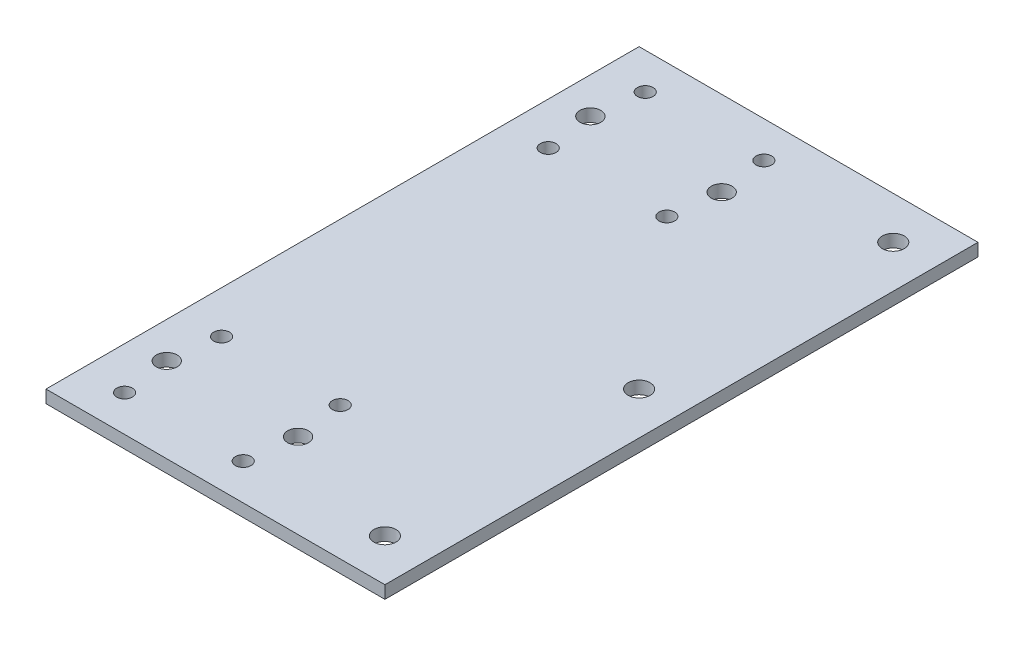
ISO-10303-21;
HEADER;
FILE_DESCRIPTION(('STEP AP214'),'2;1');
FILE_NAME('part.step','',(''),(''),'','','');
FILE_SCHEMA(('AUTOMOTIVE_DESIGN { 1 0 10303 214 1 1 1 1 }'));
ENDSEC;
DATA;
#1=APPLICATION_CONTEXT('core data for automotive mechanical design processes');
#2=APPLICATION_PROTOCOL_DEFINITION('international standard','automotive_design',2000,#1);
#3=PRODUCT_CONTEXT('',#1,'mechanical');
#4=PRODUCT('Part','Part','',(#3));
#5=PRODUCT_RELATED_PRODUCT_CATEGORY('part','',(#4));
#6=PRODUCT_DEFINITION_FORMATION('','',#4);
#7=PRODUCT_DEFINITION_CONTEXT('part definition',#1,'design');
#8=PRODUCT_DEFINITION('design','',#6,#7);
#9=PRODUCT_DEFINITION_SHAPE('','',#8);
#10=(LENGTH_UNIT() NAMED_UNIT(*) SI_UNIT(.MILLI.,.METRE.));
#11=(NAMED_UNIT(*) PLANE_ANGLE_UNIT() SI_UNIT($,.RADIAN.));
#12=(NAMED_UNIT(*) SI_UNIT($,.STERADIAN.) SOLID_ANGLE_UNIT());
#13=UNCERTAINTY_MEASURE_WITH_UNIT(LENGTH_MEASURE(1.E-05),#10,'distance_accuracy_value','');
#14=(GEOMETRIC_REPRESENTATION_CONTEXT(3) GLOBAL_UNCERTAINTY_ASSIGNED_CONTEXT((#13)) GLOBAL_UNIT_ASSIGNED_CONTEXT((#10,
#11,#12)) REPRESENTATION_CONTEXT('',''));
#15=CARTESIAN_POINT('',(0.,0.,0.));
#16=DIRECTION('',(0.,0.,1.));
#17=DIRECTION('',(1.,0.,0.));
#18=AXIS2_PLACEMENT_3D('',#15,#16,#17);
#19=CARTESIAN_POINT('',(40.,3.,0.));
#20=DIRECTION('',(-1.,0.,0.));
#21=DIRECTION('',(0.,0.,1.));
#22=AXIS2_PLACEMENT_3D('',#19,#20,#21);
#23=PLANE('',#22);
#24=DIRECTION('',(0.,0.,-1.));
#25=VECTOR('',#24,1.);
#26=CARTESIAN_POINT('',(40.,0.,0.));
#27=LINE('',#26,#25);
#28=CARTESIAN_POINT('',(40.,0.,70.));
#29=VERTEX_POINT('',#28);
#30=CARTESIAN_POINT('',(40.,0.,-70.));
#31=VERTEX_POINT('',#30);
#32=EDGE_CURVE('E166',#29,#31,#27,.T.);
#33=ORIENTED_EDGE('',*,*,#32,.T.);
#34=DIRECTION('',(0.,-1.,0.));
#35=VECTOR('',#34,1.);
#36=CARTESIAN_POINT('',(40.,3.,-70.));
#37=LINE('',#36,#35);
#38=CARTESIAN_POINT('',(40.,3.,-70.));
#39=VERTEX_POINT('',#38);
#40=EDGE_CURVE('E11',#39,#31,#37,.T.);
#41=ORIENTED_EDGE('',*,*,#40,.F.);
#42=DIRECTION('',(0.,0.,-1.));
#43=VECTOR('',#42,1.);
#44=CARTESIAN_POINT('',(40.,3.,0.));
#45=LINE('',#44,#43);
#46=CARTESIAN_POINT('',(40.,3.,70.));
#47=VERTEX_POINT('',#46);
#48=EDGE_CURVE('E89',#47,#39,#45,.T.);
#49=ORIENTED_EDGE('',*,*,#48,.F.);
#50=DIRECTION('',(0.,-1.,0.));
#51=VECTOR('',#50,1.);
#52=CARTESIAN_POINT('',(40.,3.,70.));
#53=LINE('',#52,#51);
#54=EDGE_CURVE('E161',#47,#29,#53,.T.);
#55=ORIENTED_EDGE('',*,*,#54,.T.);
#56=EDGE_LOOP('',(#33,#41,#49,#55));
#57=FACE_BOUND('',#56,.T.);
#58=ADVANCED_FACE('F46',(#57),#23,.F.);
#59=CARTESIAN_POINT('',(0.,3.,-70.));
#60=DIRECTION('',(0.,0.,-1.));
#61=DIRECTION('',(-1.,0.,0.));
#62=AXIS2_PLACEMENT_3D('',#59,#60,#61);
#63=PLANE('',#62);
#64=DIRECTION('',(1.,0.,0.));
#65=VECTOR('',#64,1.);
#66=CARTESIAN_POINT('',(0.,0.,-70.));
#67=LINE('',#66,#65);
#68=CARTESIAN_POINT('',(-40.,0.,-70.));
#69=VERTEX_POINT('',#68);
#70=EDGE_CURVE('E98',#69,#31,#67,.T.);
#71=ORIENTED_EDGE('',*,*,#70,.F.);
#72=DIRECTION('',(0.,-1.,0.));
#73=VECTOR('',#72,1.);
#74=CARTESIAN_POINT('',(-40.,3.,-70.));
#75=LINE('',#74,#73);
#76=CARTESIAN_POINT('',(-40.,3.,-70.));
#77=VERTEX_POINT('',#76);
#78=EDGE_CURVE('E57',#77,#69,#75,.T.);
#79=ORIENTED_EDGE('',*,*,#78,.F.);
#80=DIRECTION('',(1.,0.,0.));
#81=VECTOR('',#80,1.);
#82=CARTESIAN_POINT('',(0.,3.,-70.));
#83=LINE('',#82,#81);
#84=EDGE_CURVE('E96',#77,#39,#83,.T.);
#85=ORIENTED_EDGE('',*,*,#84,.T.);
#86=ORIENTED_EDGE('',*,*,#40,.T.);
#87=EDGE_LOOP('',(#71,#79,#85,#86));
#88=FACE_BOUND('',#87,.T.);
#89=ADVANCED_FACE('F95',(#88),#63,.T.);
#90=CARTESIAN_POINT('',(-40.,3.,0.));
#91=DIRECTION('',(-1.,0.,0.));
#92=DIRECTION('',(0.,0.,1.));
#93=AXIS2_PLACEMENT_3D('',#90,#91,#92);
#94=PLANE('',#93);
#95=DIRECTION('',(0.,0.,-1.));
#96=VECTOR('',#95,1.);
#97=CARTESIAN_POINT('',(-40.,0.,0.));
#98=LINE('',#97,#96);
#99=CARTESIAN_POINT('',(-40.,0.,70.));
#100=VERTEX_POINT('',#99);
#101=EDGE_CURVE('E172',#100,#69,#98,.T.);
#102=ORIENTED_EDGE('',*,*,#101,.F.);
#103=DIRECTION('',(0.,-1.,0.));
#104=VECTOR('',#103,1.);
#105=CARTESIAN_POINT('',(-40.,3.,70.));
#106=LINE('',#105,#104);
#107=CARTESIAN_POINT('',(-40.,3.,70.));
#108=VERTEX_POINT('',#107);
#109=EDGE_CURVE('E81',#108,#100,#106,.T.);
#110=ORIENTED_EDGE('',*,*,#109,.F.);
#111=DIRECTION('',(0.,0.,-1.));
#112=VECTOR('',#111,1.);
#113=CARTESIAN_POINT('',(-40.,3.,0.));
#114=LINE('',#113,#112);
#115=EDGE_CURVE('E107',#108,#77,#114,.T.);
#116=ORIENTED_EDGE('',*,*,#115,.T.);
#117=ORIENTED_EDGE('',*,*,#78,.T.);
#118=EDGE_LOOP('',(#102,#110,#116,#117));
#119=FACE_BOUND('',#118,.T.);
#120=ADVANCED_FACE('F110',(#119),#94,.T.);
#121=CARTESIAN_POINT('',(-0.499999999999992,3.,-50.));
#122=DIRECTION('',(0.,-1.,0.));
#123=DIRECTION('',(0.,0.,-1.));
#124=AXIS2_PLACEMENT_3D('',#121,#122,#123);
#125=CYLINDRICAL_SURFACE('',#124,2.45);
#126=CARTESIAN_POINT('',(-0.499999999999992,3.,-50.));
#127=DIRECTION('',(0.,1.,0.));
#128=DIRECTION('',(0.,0.,1.));
#129=AXIS2_PLACEMENT_3D('',#126,#127,#128);
#130=CIRCLE('',#129,2.45);
#131=CARTESIAN_POINT('',(-0.499999999999992,3.,-47.55));
#132=VERTEX_POINT('',#131);
#133=EDGE_CURVE('E153',#132,#132,#130,.T.);
#134=ORIENTED_EDGE('',*,*,#133,.T.);
#135=EDGE_LOOP('',(#134));
#136=FACE_BOUND('',#135,.T.);
#137=CARTESIAN_POINT('',(-0.499999999999992,0.,-50.));
#138=DIRECTION('',(0.,1.,0.));
#139=DIRECTION('',(0.,0.,1.));
#140=AXIS2_PLACEMENT_3D('',#137,#138,#139);
#141=CIRCLE('',#140,2.45);
#142=CARTESIAN_POINT('',(-0.499999999999992,0.,-47.55));
#143=VERTEX_POINT('',#142);
#144=EDGE_CURVE('E213',#143,#143,#141,.T.);
#145=ORIENTED_EDGE('',*,*,#144,.F.);
#146=EDGE_LOOP('',(#145));
#147=FACE_BOUND('',#146,.T.);
#148=ADVANCED_FACE('F262',(#136,#147),#125,.F.);
#149=CARTESIAN_POINT('',(-2.00000000000001,3.,-61.45));
#150=DIRECTION('',(0.,-1.,0.));
#151=DIRECTION('',(0.,0.,-1.));
#152=AXIS2_PLACEMENT_3D('',#149,#150,#151);
#153=CYLINDRICAL_SURFACE('',#152,1.85);
#154=CARTESIAN_POINT('',(-2.00000000000001,3.,-61.45));
#155=DIRECTION('',(0.,1.,0.));
#156=DIRECTION('',(0.,0.,1.));
#157=AXIS2_PLACEMENT_3D('',#154,#155,#156);
#158=CIRCLE('',#157,1.85);
#159=CARTESIAN_POINT('',(-2.00000000000001,3.,-59.6));
#160=VERTEX_POINT('',#159);
#161=EDGE_CURVE('E149',#160,#160,#158,.F.);
#162=ORIENTED_EDGE('',*,*,#161,.F.);
#163=EDGE_LOOP('',(#162));
#164=FACE_BOUND('',#163,.T.);
#165=CARTESIAN_POINT('',(-2.00000000000001,0.,-61.45));
#166=DIRECTION('',(0.,1.,0.));
#167=DIRECTION('',(0.,0.,1.));
#168=AXIS2_PLACEMENT_3D('',#165,#166,#167);
#169=CIRCLE('',#168,1.85);
#170=CARTESIAN_POINT('',(-2.00000000000001,0.,-59.6));
#171=VERTEX_POINT('',#170);
#172=EDGE_CURVE('E209',#171,#171,#169,.F.);
#173=ORIENTED_EDGE('',*,*,#172,.T.);
#174=EDGE_LOOP('',(#173));
#175=FACE_BOUND('',#174,.T.);
#176=ADVANCED_FACE('F297',(#164,#175),#153,.F.);
#177=CARTESIAN_POINT('',(-2.00000000000001,3.,-38.55));
#178=DIRECTION('',(0.,-1.,0.));
#179=DIRECTION('',(0.,0.,-1.));
#180=AXIS2_PLACEMENT_3D('',#177,#178,#179);
#181=CYLINDRICAL_SURFACE('',#180,1.85);
#182=CARTESIAN_POINT('',(-2.00000000000001,3.,-38.55));
#183=DIRECTION('',(0.,1.,0.));
#184=DIRECTION('',(0.,0.,1.));
#185=AXIS2_PLACEMENT_3D('',#182,#183,#184);
#186=CIRCLE('',#185,1.85);
#187=CARTESIAN_POINT('',(-2.00000000000001,3.,-36.7));
#188=VERTEX_POINT('',#187);
#189=EDGE_CURVE('E145',#188,#188,#186,.T.);
#190=ORIENTED_EDGE('',*,*,#189,.T.);
#191=EDGE_LOOP('',(#190));
#192=FACE_BOUND('',#191,.T.);
#193=CARTESIAN_POINT('',(-2.00000000000001,0.,-38.55));
#194=DIRECTION('',(0.,1.,0.));
#195=DIRECTION('',(0.,0.,1.));
#196=AXIS2_PLACEMENT_3D('',#193,#194,#195);
#197=CIRCLE('',#196,1.85);
#198=CARTESIAN_POINT('',(-2.00000000000001,0.,-36.7));
#199=VERTEX_POINT('',#198);
#200=EDGE_CURVE('E205',#199,#199,#197,.T.);
#201=ORIENTED_EDGE('',*,*,#200,.F.);
#202=EDGE_LOOP('',(#201));
#203=FACE_BOUND('',#202,.T.);
#204=ADVANCED_FACE('F293',(#192,#203),#181,.F.);
#205=CARTESIAN_POINT('',(-30.,3.,-38.55));
#206=DIRECTION('',(0.,-1.,0.));
#207=DIRECTION('',(0.,0.,-1.));
#208=AXIS2_PLACEMENT_3D('',#205,#206,#207);
#209=CYLINDRICAL_SURFACE('',#208,1.85);
#210=CARTESIAN_POINT('',(-30.,3.,-38.55));
#211=DIRECTION('',(0.,1.,0.));
#212=DIRECTION('',(0.,0.,1.));
#213=AXIS2_PLACEMENT_3D('',#210,#211,#212);
#214=CIRCLE('',#213,1.85);
#215=CARTESIAN_POINT('',(-30.,3.,-36.7));
#216=VERTEX_POINT('',#215);
#217=EDGE_CURVE('E141',#216,#216,#214,.F.);
#218=ORIENTED_EDGE('',*,*,#217,.F.);
#219=EDGE_LOOP('',(#218));
#220=FACE_BOUND('',#219,.T.);
#221=CARTESIAN_POINT('',(-30.,0.,-38.55));
#222=DIRECTION('',(0.,1.,0.));
#223=DIRECTION('',(0.,0.,1.));
#224=AXIS2_PLACEMENT_3D('',#221,#222,#223);
#225=CIRCLE('',#224,1.85);
#226=CARTESIAN_POINT('',(-30.,0.,-36.7));
#227=VERTEX_POINT('',#226);
#228=EDGE_CURVE('E201',#227,#227,#225,.F.);
#229=ORIENTED_EDGE('',*,*,#228,.T.);
#230=EDGE_LOOP('',(#229));
#231=FACE_BOUND('',#230,.T.);
#232=ADVANCED_FACE('F289',(#220,#231),#209,.F.);
#233=CARTESIAN_POINT('',(-30.,3.,61.4500000000001));
#234=DIRECTION('',(0.,-1.,0.));
#235=DIRECTION('',(0.,0.,-1.));
#236=AXIS2_PLACEMENT_3D('',#233,#234,#235);
#237=CYLINDRICAL_SURFACE('',#236,1.85);
#238=CARTESIAN_POINT('',(-30.,3.,61.4500000000001));
#239=DIRECTION('',(0.,1.,0.));
#240=DIRECTION('',(0.,0.,1.));
#241=AXIS2_PLACEMENT_3D('',#238,#239,#240);
#242=CIRCLE('',#241,1.85);
#243=CARTESIAN_POINT('',(-30.,3.,63.3000000000001));
#244=VERTEX_POINT('',#243);
#245=EDGE_CURVE('E137',#244,#244,#242,.F.);
#246=ORIENTED_EDGE('',*,*,#245,.F.);
#247=EDGE_LOOP('',(#246));
#248=FACE_BOUND('',#247,.T.);
#249=CARTESIAN_POINT('',(-30.,0.,61.4500000000001));
#250=DIRECTION('',(0.,1.,0.));
#251=DIRECTION('',(0.,0.,1.));
#252=AXIS2_PLACEMENT_3D('',#249,#250,#251);
#253=CIRCLE('',#252,1.85);
#254=CARTESIAN_POINT('',(-30.,0.,63.3000000000001));
#255=VERTEX_POINT('',#254);
#256=EDGE_CURVE('E197',#255,#255,#253,.F.);
#257=ORIENTED_EDGE('',*,*,#256,.T.);
#258=EDGE_LOOP('',(#257));
#259=FACE_BOUND('',#258,.T.);
#260=ADVANCED_FACE('F285',(#248,#259),#237,.F.);
#261=CARTESIAN_POINT('',(-31.5,3.,50.));
#262=DIRECTION('',(0.,-1.,0.));
#263=DIRECTION('',(0.,0.,-1.));
#264=AXIS2_PLACEMENT_3D('',#261,#262,#263);
#265=CYLINDRICAL_SURFACE('',#264,2.45);
#266=CARTESIAN_POINT('',(-31.5,3.,50.));
#267=DIRECTION('',(0.,1.,0.));
#268=DIRECTION('',(0.,0.,1.));
#269=AXIS2_PLACEMENT_3D('',#266,#267,#268);
#270=CIRCLE('',#269,2.45);
#271=CARTESIAN_POINT('',(-31.5,3.,52.4500000000001));
#272=VERTEX_POINT('',#271);
#273=EDGE_CURVE('E133',#272,#272,#270,.T.);
#274=ORIENTED_EDGE('',*,*,#273,.T.);
#275=EDGE_LOOP('',(#274));
#276=FACE_BOUND('',#275,.T.);
#277=CARTESIAN_POINT('',(-31.5,0.,50.));
#278=DIRECTION('',(0.,1.,0.));
#279=DIRECTION('',(0.,0.,1.));
#280=AXIS2_PLACEMENT_3D('',#277,#278,#279);
#281=CIRCLE('',#280,2.45);
#282=CARTESIAN_POINT('',(-31.5,0.,52.4500000000001));
#283=VERTEX_POINT('',#282);
#284=EDGE_CURVE('E193',#283,#283,#281,.T.);
#285=ORIENTED_EDGE('',*,*,#284,.F.);
#286=EDGE_LOOP('',(#285));
#287=FACE_BOUND('',#286,.T.);
#288=ADVANCED_FACE('F281',(#276,#287),#265,.F.);
#289=CARTESIAN_POINT('',(-30.,3.,38.55));
#290=DIRECTION('',(0.,-1.,0.));
#291=DIRECTION('',(0.,0.,-1.));
#292=AXIS2_PLACEMENT_3D('',#289,#290,#291);
#293=CYLINDRICAL_SURFACE('',#292,1.85);
#294=CARTESIAN_POINT('',(-30.,3.,38.55));
#295=DIRECTION('',(0.,1.,0.));
#296=DIRECTION('',(0.,0.,1.));
#297=AXIS2_PLACEMENT_3D('',#294,#295,#296);
#298=CIRCLE('',#297,1.85);
#299=CARTESIAN_POINT('',(-30.,3.,40.4));
#300=VERTEX_POINT('',#299);
#301=EDGE_CURVE('E129',#300,#300,#298,.T.);
#302=ORIENTED_EDGE('',*,*,#301,.T.);
#303=EDGE_LOOP('',(#302));
#304=FACE_BOUND('',#303,.T.);
#305=CARTESIAN_POINT('',(-30.,0.,38.55));
#306=DIRECTION('',(0.,1.,0.));
#307=DIRECTION('',(0.,0.,1.));
#308=AXIS2_PLACEMENT_3D('',#305,#306,#307);
#309=CIRCLE('',#308,1.85);
#310=CARTESIAN_POINT('',(-30.,0.,40.4));
#311=VERTEX_POINT('',#310);
#312=EDGE_CURVE('E189',#311,#311,#309,.T.);
#313=ORIENTED_EDGE('',*,*,#312,.F.);
#314=EDGE_LOOP('',(#313));
#315=FACE_BOUND('',#314,.T.);
#316=ADVANCED_FACE('F277',(#304,#315),#293,.F.);
#317=CARTESIAN_POINT('',(-2.00000000000001,3.,61.4500000000001));
#318=DIRECTION('',(0.,-1.,0.));
#319=DIRECTION('',(0.,0.,-1.));
#320=AXIS2_PLACEMENT_3D('',#317,#318,#319);
#321=CYLINDRICAL_SURFACE('',#320,1.85);
#322=CARTESIAN_POINT('',(-2.00000000000001,3.,61.4500000000001));
#323=DIRECTION('',(0.,1.,0.));
#324=DIRECTION('',(0.,0.,1.));
#325=AXIS2_PLACEMENT_3D('',#322,#323,#324);
#326=CIRCLE('',#325,1.85);
#327=CARTESIAN_POINT('',(-2.00000000000001,3.,63.3000000000001));
#328=VERTEX_POINT('',#327);
#329=EDGE_CURVE('E125',#328,#328,#326,.T.);
#330=ORIENTED_EDGE('',*,*,#329,.T.);
#331=EDGE_LOOP('',(#330));
#332=FACE_BOUND('',#331,.T.);
#333=CARTESIAN_POINT('',(-2.00000000000001,0.,61.4500000000001));
#334=DIRECTION('',(0.,1.,0.));
#335=DIRECTION('',(0.,0.,1.));
#336=AXIS2_PLACEMENT_3D('',#333,#334,#335);
#337=CIRCLE('',#336,1.85);
#338=CARTESIAN_POINT('',(-2.00000000000001,0.,63.3000000000001));
#339=VERTEX_POINT('',#338);
#340=EDGE_CURVE('E185',#339,#339,#337,.T.);
#341=ORIENTED_EDGE('',*,*,#340,.F.);
#342=EDGE_LOOP('',(#341));
#343=FACE_BOUND('',#342,.T.);
#344=ADVANCED_FACE('F273',(#332,#343),#321,.F.);
#345=CARTESIAN_POINT('',(-2.00000000000001,3.,38.55));
#346=DIRECTION('',(0.,-1.,0.));
#347=DIRECTION('',(0.,0.,-1.));
#348=AXIS2_PLACEMENT_3D('',#345,#346,#347);
#349=CYLINDRICAL_SURFACE('',#348,1.85);
#350=CARTESIAN_POINT('',(-2.00000000000001,3.,38.55));
#351=DIRECTION('',(0.,1.,0.));
#352=DIRECTION('',(0.,0.,1.));
#353=AXIS2_PLACEMENT_3D('',#350,#351,#352);
#354=CIRCLE('',#353,1.85);
#355=CARTESIAN_POINT('',(-2.00000000000001,3.,40.4));
#356=VERTEX_POINT('',#355);
#357=EDGE_CURVE('E121',#356,#356,#354,.F.);
#358=ORIENTED_EDGE('',*,*,#357,.F.);
#359=EDGE_LOOP('',(#358));
#360=FACE_BOUND('',#359,.T.);
#361=CARTESIAN_POINT('',(-2.00000000000001,0.,38.55));
#362=DIRECTION('',(0.,1.,0.));
#363=DIRECTION('',(0.,0.,1.));
#364=AXIS2_PLACEMENT_3D('',#361,#362,#363);
#365=CIRCLE('',#364,1.85);
#366=CARTESIAN_POINT('',(-2.00000000000001,0.,40.4));
#367=VERTEX_POINT('',#366);
#368=EDGE_CURVE('E181',#367,#367,#365,.F.);
#369=ORIENTED_EDGE('',*,*,#368,.T.);
#370=EDGE_LOOP('',(#369));
#371=FACE_BOUND('',#370,.T.);
#372=ADVANCED_FACE('F269',(#360,#371),#349,.F.);
#373=CARTESIAN_POINT('',(-0.499999999999992,3.,50.));
#374=DIRECTION('',(0.,-1.,0.));
#375=DIRECTION('',(0.,0.,-1.));
#376=AXIS2_PLACEMENT_3D('',#373,#374,#375);
#377=CYLINDRICAL_SURFACE('',#376,2.45);
#378=CARTESIAN_POINT('',(-0.499999999999992,3.,50.));
#379=DIRECTION('',(0.,1.,0.));
#380=DIRECTION('',(0.,0.,1.));
#381=AXIS2_PLACEMENT_3D('',#378,#379,#380);
#382=CIRCLE('',#381,2.45);
#383=CARTESIAN_POINT('',(-0.499999999999992,3.,52.4500000000001));
#384=VERTEX_POINT('',#383);
#385=EDGE_CURVE('E114',#384,#384,#382,.F.);
#386=ORIENTED_EDGE('',*,*,#385,.F.);
#387=EDGE_LOOP('',(#386));
#388=FACE_BOUND('',#387,.T.);
#389=CARTESIAN_POINT('',(-0.499999999999992,0.,50.));
#390=DIRECTION('',(0.,1.,0.));
#391=DIRECTION('',(0.,0.,1.));
#392=AXIS2_PLACEMENT_3D('',#389,#390,#391);
#393=CIRCLE('',#392,2.45);
#394=CARTESIAN_POINT('',(-0.499999999999992,0.,52.4500000000001));
#395=VERTEX_POINT('',#394);
#396=EDGE_CURVE('E177',#395,#395,#393,.F.);
#397=ORIENTED_EDGE('',*,*,#396,.T.);
#398=EDGE_LOOP('',(#397));
#399=FACE_BOUND('',#398,.T.);
#400=ADVANCED_FACE('F266',(#388,#399),#377,.F.);
#401=CARTESIAN_POINT('',(0.,3.,70.));
#402=DIRECTION('',(0.,0.,-1.));
#403=DIRECTION('',(-1.,0.,0.));
#404=AXIS2_PLACEMENT_3D('',#401,#402,#403);
#405=PLANE('',#404);
#406=DIRECTION('',(1.,0.,0.));
#407=VECTOR('',#406,1.);
#408=CARTESIAN_POINT('',(0.,0.,70.));
#409=LINE('',#408,#407);
#410=EDGE_CURVE('E84',#100,#29,#409,.T.);
#411=ORIENTED_EDGE('',*,*,#410,.T.);
#412=ORIENTED_EDGE('',*,*,#54,.F.);
#413=DIRECTION('',(1.,0.,0.));
#414=VECTOR('',#413,1.);
#415=CARTESIAN_POINT('',(0.,3.,70.));
#416=LINE('',#415,#414);
#417=EDGE_CURVE('E66',#108,#47,#416,.T.);
#418=ORIENTED_EDGE('',*,*,#417,.F.);
#419=ORIENTED_EDGE('',*,*,#109,.T.);
#420=EDGE_LOOP('',(#411,#412,#418,#419));
#421=FACE_BOUND('',#420,.T.);
#422=ADVANCED_FACE('F263',(#421),#405,.F.);
#423=CARTESIAN_POINT('',(-30.,3.,-61.45));
#424=DIRECTION('',(0.,-1.,0.));
#425=DIRECTION('',(0.,0.,-1.));
#426=AXIS2_PLACEMENT_3D('',#423,#424,#425);
#427=CYLINDRICAL_SURFACE('',#426,1.85);
#428=CARTESIAN_POINT('',(-30.,3.,-61.45));
#429=DIRECTION('',(0.,1.,0.));
#430=DIRECTION('',(0.,0.,1.));
#431=AXIS2_PLACEMENT_3D('',#428,#429,#430);
#432=CIRCLE('',#431,1.85);
#433=CARTESIAN_POINT('',(-30.,3.,-59.6));
#434=VERTEX_POINT('',#433);
#435=EDGE_CURVE('E221',#434,#434,#432,.T.);
#436=ORIENTED_EDGE('',*,*,#435,.T.);
#437=EDGE_LOOP('',(#436));
#438=FACE_BOUND('',#437,.T.);
#439=CARTESIAN_POINT('',(-30.,0.,-61.45));
#440=DIRECTION('',(0.,1.,0.));
#441=DIRECTION('',(0.,0.,1.));
#442=AXIS2_PLACEMENT_3D('',#439,#440,#441);
#443=CIRCLE('',#442,1.85);
#444=CARTESIAN_POINT('',(-30.,0.,-59.6));
#445=VERTEX_POINT('',#444);
#446=EDGE_CURVE('E162',#445,#445,#443,.T.);
#447=ORIENTED_EDGE('',*,*,#446,.F.);
#448=EDGE_LOOP('',(#447));
#449=FACE_BOUND('',#448,.T.);
#450=ADVANCED_FACE('F48',(#438,#449),#427,.F.);
#451=CARTESIAN_POINT('',(-31.5,3.,-50.));
#452=DIRECTION('',(0.,-1.,0.));
#453=DIRECTION('',(0.,0.,-1.));
#454=AXIS2_PLACEMENT_3D('',#451,#452,#453);
#455=CYLINDRICAL_SURFACE('',#454,2.45);
#456=CARTESIAN_POINT('',(-31.5,3.,-50.));
#457=DIRECTION('',(0.,1.,0.));
#458=DIRECTION('',(0.,0.,1.));
#459=AXIS2_PLACEMENT_3D('',#456,#457,#458);
#460=CIRCLE('',#459,2.45);
#461=CARTESIAN_POINT('',(-31.5,3.,-47.55));
#462=VERTEX_POINT('',#461);
#463=EDGE_CURVE('E157',#462,#462,#460,.F.);
#464=ORIENTED_EDGE('',*,*,#463,.F.);
#465=EDGE_LOOP('',(#464));
#466=FACE_BOUND('',#465,.T.);
#467=CARTESIAN_POINT('',(-31.5,0.,-50.));
#468=DIRECTION('',(0.,1.,0.));
#469=DIRECTION('',(0.,0.,1.));
#470=AXIS2_PLACEMENT_3D('',#467,#468,#469);
#471=CIRCLE('',#470,2.45);
#472=CARTESIAN_POINT('',(-31.5,0.,-47.55));
#473=VERTEX_POINT('',#472);
#474=EDGE_CURVE('E217',#473,#473,#471,.F.);
#475=ORIENTED_EDGE('',*,*,#474,.T.);
#476=EDGE_LOOP('',(#475));
#477=FACE_BOUND('',#476,.T.);
#478=ADVANCED_FACE('F305',(#466,#477),#455,.F.);
#479=CARTESIAN_POINT('',(0.,3.,0.));
#480=DIRECTION('',(0.,1.,0.));
#481=DIRECTION('',(0.,0.,1.));
#482=AXIS2_PLACEMENT_3D('',#479,#480,#481);
#483=PLANE('',#482);
#484=CARTESIAN_POINT('',(30.,3.,-60.));
#485=DIRECTION('',(0.,1.,0.));
#486=DIRECTION('',(0.,0.,1.));
#487=AXIS2_PLACEMENT_3D('',#484,#485,#486);
#488=CIRCLE('',#487,2.6);
#489=CARTESIAN_POINT('',(30.,3.,-57.4));
#490=VERTEX_POINT('',#489);
#491=EDGE_CURVE('E230',#490,#490,#488,.T.);
#492=ORIENTED_EDGE('',*,*,#491,.F.);
#493=EDGE_LOOP('',(#492));
#494=FACE_BOUND('',#493,.T.);
#495=CARTESIAN_POINT('',(30.0000000000006,3.,0.));
#496=DIRECTION('',(0.,1.,0.));
#497=DIRECTION('',(0.,0.,1.));
#498=AXIS2_PLACEMENT_3D('',#495,#496,#497);
#499=CIRCLE('',#498,2.6);
#500=CARTESIAN_POINT('',(30.0000000000006,3.,2.59999999999998));
#501=VERTEX_POINT('',#500);
#502=EDGE_CURVE('E368',#501,#501,#499,.T.);
#503=ORIENTED_EDGE('',*,*,#502,.F.);
#504=EDGE_LOOP('',(#503));
#505=FACE_BOUND('',#504,.T.);
#506=CARTESIAN_POINT('',(30.0000000000012,3.,60.));
#507=DIRECTION('',(0.,1.,0.));
#508=DIRECTION('',(0.,0.,1.));
#509=AXIS2_PLACEMENT_3D('',#506,#507,#508);
#510=CIRCLE('',#509,2.6);
#511=CARTESIAN_POINT('',(30.0000000000012,3.,62.6));
#512=VERTEX_POINT('',#511);
#513=EDGE_CURVE('E321',#512,#512,#510,.T.);
#514=ORIENTED_EDGE('',*,*,#513,.F.);
#515=EDGE_LOOP('',(#514));
#516=FACE_BOUND('',#515,.T.);
#517=ORIENTED_EDGE('',*,*,#435,.F.);
#518=EDGE_LOOP('',(#517));
#519=FACE_BOUND('',#518,.T.);
#520=ORIENTED_EDGE('',*,*,#48,.T.);
#521=ORIENTED_EDGE('',*,*,#84,.F.);
#522=ORIENTED_EDGE('',*,*,#115,.F.);
#523=ORIENTED_EDGE('',*,*,#417,.T.);
#524=EDGE_LOOP('',(#520,#521,#522,#523));
#525=FACE_BOUND('',#524,.T.);
#526=ORIENTED_EDGE('',*,*,#385,.T.);
#527=EDGE_LOOP('',(#526));
#528=FACE_BOUND('',#527,.T.);
#529=ORIENTED_EDGE('',*,*,#357,.T.);
#530=EDGE_LOOP('',(#529));
#531=FACE_BOUND('',#530,.T.);
#532=ORIENTED_EDGE('',*,*,#329,.F.);
#533=EDGE_LOOP('',(#532));
#534=FACE_BOUND('',#533,.T.);
#535=ORIENTED_EDGE('',*,*,#301,.F.);
#536=EDGE_LOOP('',(#535));
#537=FACE_BOUND('',#536,.T.);
#538=ORIENTED_EDGE('',*,*,#273,.F.);
#539=EDGE_LOOP('',(#538));
#540=FACE_BOUND('',#539,.T.);
#541=ORIENTED_EDGE('',*,*,#245,.T.);
#542=EDGE_LOOP('',(#541));
#543=FACE_BOUND('',#542,.T.);
#544=ORIENTED_EDGE('',*,*,#217,.T.);
#545=EDGE_LOOP('',(#544));
#546=FACE_BOUND('',#545,.T.);
#547=ORIENTED_EDGE('',*,*,#189,.F.);
#548=EDGE_LOOP('',(#547));
#549=FACE_BOUND('',#548,.T.);
#550=ORIENTED_EDGE('',*,*,#161,.T.);
#551=EDGE_LOOP('',(#550));
#552=FACE_BOUND('',#551,.T.);
#553=ORIENTED_EDGE('',*,*,#133,.F.);
#554=EDGE_LOOP('',(#553));
#555=FACE_BOUND('',#554,.T.);
#556=ORIENTED_EDGE('',*,*,#463,.T.);
#557=EDGE_LOOP('',(#556));
#558=FACE_BOUND('',#557,.T.);
#559=ADVANCED_FACE('F105',(#494,#505,#516,#519,#525,#528,#531,#534,#537,#540,#543,#546,#549,
#552,#555,#558),#483,.T.);
#560=CARTESIAN_POINT('',(0.,0.,0.));
#561=DIRECTION('',(0.,1.,0.));
#562=DIRECTION('',(0.,0.,1.));
#563=AXIS2_PLACEMENT_3D('',#560,#561,#562);
#564=PLANE('',#563);
#565=CARTESIAN_POINT('',(30.,0.,-60.));
#566=DIRECTION('',(0.,1.,0.));
#567=DIRECTION('',(0.,0.,1.));
#568=AXIS2_PLACEMENT_3D('',#565,#566,#567);
#569=CIRCLE('',#568,2.6);
#570=CARTESIAN_POINT('',(30.,0.,-57.4));
#571=VERTEX_POINT('',#570);
#572=EDGE_CURVE('E50',#571,#571,#569,.T.);
#573=ORIENTED_EDGE('',*,*,#572,.T.);
#574=EDGE_LOOP('',(#573));
#575=FACE_BOUND('',#574,.T.);
#576=CARTESIAN_POINT('',(30.0000000000006,0.,0.));
#577=DIRECTION('',(0.,1.,0.));
#578=DIRECTION('',(0.,0.,1.));
#579=AXIS2_PLACEMENT_3D('',#576,#577,#578);
#580=CIRCLE('',#579,2.6);
#581=CARTESIAN_POINT('',(30.0000000000006,0.,2.59999999999998));
#582=VERTEX_POINT('',#581);
#583=EDGE_CURVE('E229',#582,#582,#580,.T.);
#584=ORIENTED_EDGE('',*,*,#583,.T.);
#585=EDGE_LOOP('',(#584));
#586=FACE_BOUND('',#585,.T.);
#587=CARTESIAN_POINT('',(30.0000000000012,0.,60.));
#588=DIRECTION('',(0.,1.,0.));
#589=DIRECTION('',(0.,0.,1.));
#590=AXIS2_PLACEMENT_3D('',#587,#588,#589);
#591=CIRCLE('',#590,2.6);
#592=CARTESIAN_POINT('',(30.0000000000012,0.,62.6));
#593=VERTEX_POINT('',#592);
#594=EDGE_CURVE('E226',#593,#593,#591,.T.);
#595=ORIENTED_EDGE('',*,*,#594,.T.);
#596=EDGE_LOOP('',(#595));
#597=FACE_BOUND('',#596,.T.);
#598=ORIENTED_EDGE('',*,*,#446,.T.);
#599=EDGE_LOOP('',(#598));
#600=FACE_BOUND('',#599,.T.);
#601=ORIENTED_EDGE('',*,*,#32,.F.);
#602=ORIENTED_EDGE('',*,*,#410,.F.);
#603=ORIENTED_EDGE('',*,*,#101,.T.);
#604=ORIENTED_EDGE('',*,*,#70,.T.);
#605=EDGE_LOOP('',(#601,#602,#603,#604));
#606=FACE_BOUND('',#605,.T.);
#607=ORIENTED_EDGE('',*,*,#396,.F.);
#608=EDGE_LOOP('',(#607));
#609=FACE_BOUND('',#608,.T.);
#610=ORIENTED_EDGE('',*,*,#368,.F.);
#611=EDGE_LOOP('',(#610));
#612=FACE_BOUND('',#611,.T.);
#613=ORIENTED_EDGE('',*,*,#340,.T.);
#614=EDGE_LOOP('',(#613));
#615=FACE_BOUND('',#614,.T.);
#616=ORIENTED_EDGE('',*,*,#312,.T.);
#617=EDGE_LOOP('',(#616));
#618=FACE_BOUND('',#617,.T.);
#619=ORIENTED_EDGE('',*,*,#284,.T.);
#620=EDGE_LOOP('',(#619));
#621=FACE_BOUND('',#620,.T.);
#622=ORIENTED_EDGE('',*,*,#256,.F.);
#623=EDGE_LOOP('',(#622));
#624=FACE_BOUND('',#623,.T.);
#625=ORIENTED_EDGE('',*,*,#228,.F.);
#626=EDGE_LOOP('',(#625));
#627=FACE_BOUND('',#626,.T.);
#628=ORIENTED_EDGE('',*,*,#200,.T.);
#629=EDGE_LOOP('',(#628));
#630=FACE_BOUND('',#629,.T.);
#631=ORIENTED_EDGE('',*,*,#172,.F.);
#632=EDGE_LOOP('',(#631));
#633=FACE_BOUND('',#632,.T.);
#634=ORIENTED_EDGE('',*,*,#144,.T.);
#635=EDGE_LOOP('',(#634));
#636=FACE_BOUND('',#635,.T.);
#637=ORIENTED_EDGE('',*,*,#474,.F.);
#638=EDGE_LOOP('',(#637));
#639=FACE_BOUND('',#638,.T.);
#640=ADVANCED_FACE('F239',(#575,#586,#597,#600,#606,#609,#612,#615,#618,#621,#624,#627,#630,
#633,#636,#639),#564,.F.);
#641=CARTESIAN_POINT('',(30.0000000000012,-7.,60.));
#642=DIRECTION('',(0.,1.,0.));
#643=DIRECTION('',(0.,0.,1.));
#644=AXIS2_PLACEMENT_3D('',#641,#642,#643);
#645=CYLINDRICAL_SURFACE('',#644,2.6);
#646=ORIENTED_EDGE('',*,*,#513,.T.);
#647=EDGE_LOOP('',(#646));
#648=FACE_BOUND('',#647,.T.);
#649=ORIENTED_EDGE('',*,*,#594,.F.);
#650=EDGE_LOOP('',(#649));
#651=FACE_BOUND('',#650,.T.);
#652=ADVANCED_FACE('F249',(#648,#651),#645,.F.);
#653=CARTESIAN_POINT('',(30.0000000000006,-7.,0.));
#654=DIRECTION('',(0.,1.,0.));
#655=DIRECTION('',(0.,0.,1.));
#656=AXIS2_PLACEMENT_3D('',#653,#654,#655);
#657=CYLINDRICAL_SURFACE('',#656,2.6);
#658=ORIENTED_EDGE('',*,*,#502,.T.);
#659=EDGE_LOOP('',(#658));
#660=FACE_BOUND('',#659,.T.);
#661=ORIENTED_EDGE('',*,*,#583,.F.);
#662=EDGE_LOOP('',(#661));
#663=FACE_BOUND('',#662,.T.);
#664=ADVANCED_FACE('F243',(#660,#663),#657,.F.);
#665=CARTESIAN_POINT('',(30.,-7.,-60.));
#666=DIRECTION('',(0.,1.,0.));
#667=DIRECTION('',(0.,0.,1.));
#668=AXIS2_PLACEMENT_3D('',#665,#666,#667);
#669=CYLINDRICAL_SURFACE('',#668,2.6);
#670=ORIENTED_EDGE('',*,*,#491,.T.);
#671=EDGE_LOOP('',(#670));
#672=FACE_BOUND('',#671,.T.);
#673=ORIENTED_EDGE('',*,*,#572,.F.);
#674=EDGE_LOOP('',(#673));
#675=FACE_BOUND('',#674,.T.);
#676=ADVANCED_FACE('F241',(#672,#675),#669,.F.);
#677=CLOSED_SHELL('',(#58,#89,#120,#148,#176,#204,#232,#260,#288,#316,#344,#372,#400,#422,#450,
#478,#559,#640,#652,#664,#676));
#678=MANIFOLD_SOLID_BREP('B2',#677);
#679=ADVANCED_BREP_SHAPE_REPRESENTATION('',(#18,#678),#14);
#680=SHAPE_DEFINITION_REPRESENTATION(#9,#679);
ENDSEC;
END-ISO-10303-21;
